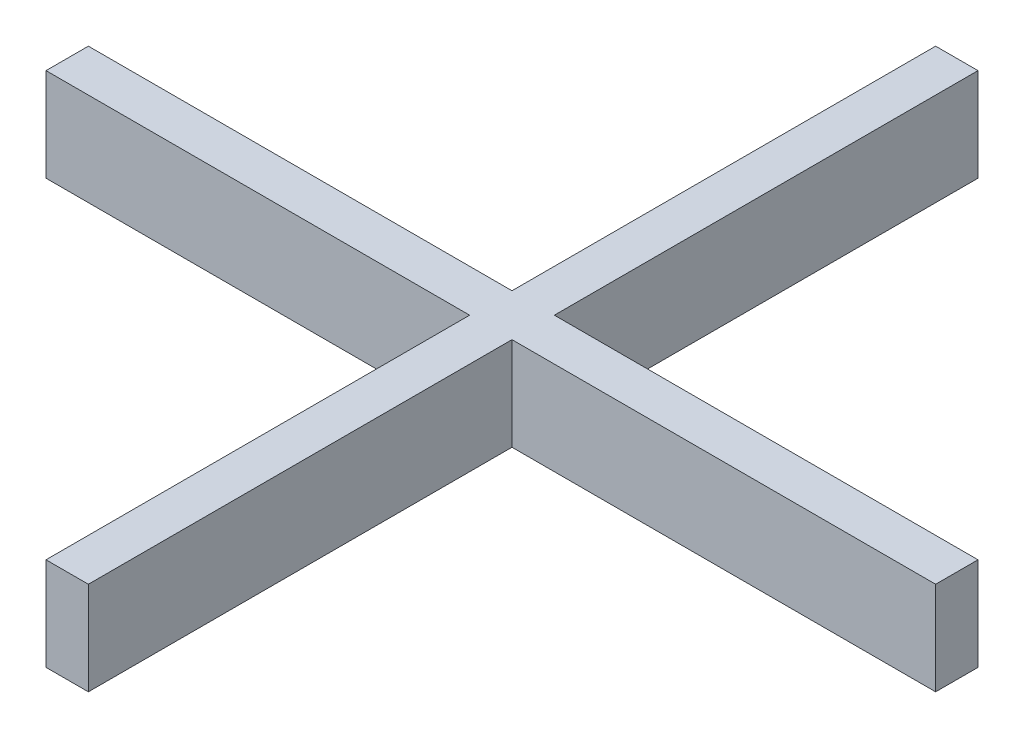
ISO-10303-21;
HEADER;
FILE_DESCRIPTION(('STEP AP214'),'2;1');
FILE_NAME('part.step','',(''),(''),'','','');
FILE_SCHEMA(('AUTOMOTIVE_DESIGN { 1 0 10303 214 1 1 1 1 }'));
ENDSEC;
DATA;
#1=APPLICATION_CONTEXT('core data for automotive mechanical design processes');
#2=APPLICATION_PROTOCOL_DEFINITION('international standard','automotive_design',2000,#1);
#3=PRODUCT_CONTEXT('',#1,'mechanical');
#4=PRODUCT('Part','Part','',(#3));
#5=PRODUCT_RELATED_PRODUCT_CATEGORY('part','',(#4));
#6=PRODUCT_DEFINITION_FORMATION('','',#4);
#7=PRODUCT_DEFINITION_CONTEXT('part definition',#1,'design');
#8=PRODUCT_DEFINITION('design','',#6,#7);
#9=PRODUCT_DEFINITION_SHAPE('','',#8);
#10=(LENGTH_UNIT() NAMED_UNIT(*) SI_UNIT(.MILLI.,.METRE.));
#11=(NAMED_UNIT(*) PLANE_ANGLE_UNIT() SI_UNIT($,.RADIAN.));
#12=(NAMED_UNIT(*) SI_UNIT($,.STERADIAN.) SOLID_ANGLE_UNIT());
#13=UNCERTAINTY_MEASURE_WITH_UNIT(LENGTH_MEASURE(1.E-05),#10,'distance_accuracy_value','');
#14=(GEOMETRIC_REPRESENTATION_CONTEXT(3) GLOBAL_UNCERTAINTY_ASSIGNED_CONTEXT((#13)) GLOBAL_UNIT_ASSIGNED_CONTEXT((#10,
#11,#12)) REPRESENTATION_CONTEXT('',''));
#15=CARTESIAN_POINT('',(0.,0.,0.));
#16=DIRECTION('',(0.,0.,1.));
#17=DIRECTION('',(1.,0.,0.));
#18=AXIS2_PLACEMENT_3D('',#15,#16,#17);
#19=CARTESIAN_POINT('',(-10.5,1.1,0.5));
#20=DIRECTION('',(1.,0.,0.));
#21=DIRECTION('',(0.,0.,-1.));
#22=AXIS2_PLACEMENT_3D('',#19,#20,#21);
#23=PLANE('',#22);
#24=DIRECTION('',(0.,0.,1.));
#25=VECTOR('',#24,1.);
#26=CARTESIAN_POINT('',(-10.5,-1.1,0.5));
#27=LINE('',#26,#25);
#28=CARTESIAN_POINT('',(-10.5,-1.1,-0.5));
#29=VERTEX_POINT('',#28);
#30=CARTESIAN_POINT('',(-10.5,-1.1,0.5));
#31=VERTEX_POINT('',#30);
#32=EDGE_CURVE('E164',#29,#31,#27,.T.);
#33=ORIENTED_EDGE('',*,*,#32,.T.);
#34=DIRECTION('',(0.,-1.,0.));
#35=VECTOR('',#34,1.);
#36=CARTESIAN_POINT('',(-10.5,1.1,0.5));
#37=LINE('',#36,#35);
#38=CARTESIAN_POINT('',(-10.5,1.1,0.5));
#39=VERTEX_POINT('',#38);
#40=EDGE_CURVE('E11',#39,#31,#37,.T.);
#41=ORIENTED_EDGE('',*,*,#40,.F.);
#42=DIRECTION('',(0.,0.,1.));
#43=VECTOR('',#42,1.);
#44=CARTESIAN_POINT('',(-10.5,1.1,0.5));
#45=LINE('',#44,#43);
#46=CARTESIAN_POINT('',(-10.5,1.1,-0.5));
#47=VERTEX_POINT('',#46);
#48=EDGE_CURVE('E198',#47,#39,#45,.T.);
#49=ORIENTED_EDGE('',*,*,#48,.F.);
#50=DIRECTION('',(0.,-1.,0.));
#51=VECTOR('',#50,1.);
#52=CARTESIAN_POINT('',(-10.5,1.1,-0.5));
#53=LINE('',#52,#51);
#54=EDGE_CURVE('E160',#47,#29,#53,.T.);
#55=ORIENTED_EDGE('',*,*,#54,.T.);
#56=EDGE_LOOP('',(#33,#41,#49,#55));
#57=FACE_BOUND('',#56,.T.);
#58=ADVANCED_FACE('F39',(#57),#23,.F.);
#59=CARTESIAN_POINT('',(-0.5,1.1,0.5));
#60=DIRECTION('',(0.,0.,-1.));
#61=DIRECTION('',(-1.,0.,0.));
#62=AXIS2_PLACEMENT_3D('',#59,#60,#61);
#63=PLANE('',#62);
#64=DIRECTION('',(1.,0.,0.));
#65=VECTOR('',#64,1.);
#66=CARTESIAN_POINT('',(-0.5,-1.1,0.5));
#67=LINE('',#66,#65);
#68=CARTESIAN_POINT('',(-0.5,-1.1,0.5));
#69=VERTEX_POINT('',#68);
#70=EDGE_CURVE('E168',#31,#69,#67,.T.);
#71=ORIENTED_EDGE('',*,*,#70,.T.);
#72=DIRECTION('',(0.,-1.,0.));
#73=VECTOR('',#72,1.);
#74=CARTESIAN_POINT('',(-0.5,1.1,0.5));
#75=LINE('',#74,#73);
#76=CARTESIAN_POINT('',(-0.5,1.1,0.5));
#77=VERTEX_POINT('',#76);
#78=EDGE_CURVE('E48',#77,#69,#75,.T.);
#79=ORIENTED_EDGE('',*,*,#78,.F.);
#80=DIRECTION('',(1.,0.,0.));
#81=VECTOR('',#80,1.);
#82=CARTESIAN_POINT('',(-0.5,1.1,0.5));
#83=LINE('',#82,#81);
#84=EDGE_CURVE('E111',#39,#77,#83,.T.);
#85=ORIENTED_EDGE('',*,*,#84,.F.);
#86=ORIENTED_EDGE('',*,*,#40,.T.);
#87=EDGE_LOOP('',(#71,#79,#85,#86));
#88=FACE_BOUND('',#87,.T.);
#89=ADVANCED_FACE('F292',(#88),#63,.F.);
#90=CARTESIAN_POINT('',(-0.5,1.1,10.5));
#91=DIRECTION('',(1.,0.,0.));
#92=DIRECTION('',(0.,0.,-1.));
#93=AXIS2_PLACEMENT_3D('',#90,#91,#92);
#94=PLANE('',#93);
#95=DIRECTION('',(0.,0.,1.));
#96=VECTOR('',#95,1.);
#97=CARTESIAN_POINT('',(-0.5,-1.1,10.5));
#98=LINE('',#97,#96);
#99=CARTESIAN_POINT('',(-0.5,-1.1,10.5));
#100=VERTEX_POINT('',#99);
#101=EDGE_CURVE('E171',#69,#100,#98,.T.);
#102=ORIENTED_EDGE('',*,*,#101,.T.);
#103=DIRECTION('',(0.,-1.,0.));
#104=VECTOR('',#103,1.);
#105=CARTESIAN_POINT('',(-0.5,1.1,10.5));
#106=LINE('',#105,#104);
#107=CARTESIAN_POINT('',(-0.5,1.1,10.5));
#108=VERTEX_POINT('',#107);
#109=EDGE_CURVE('E225',#108,#100,#106,.T.);
#110=ORIENTED_EDGE('',*,*,#109,.F.);
#111=DIRECTION('',(0.,0.,1.));
#112=VECTOR('',#111,1.);
#113=CARTESIAN_POINT('',(-0.5,1.1,10.5));
#114=LINE('',#113,#112);
#115=EDGE_CURVE('E235',#77,#108,#114,.T.);
#116=ORIENTED_EDGE('',*,*,#115,.F.);
#117=ORIENTED_EDGE('',*,*,#78,.T.);
#118=EDGE_LOOP('',(#102,#110,#116,#117));
#119=FACE_BOUND('',#118,.T.);
#120=ADVANCED_FACE('F233',(#119),#94,.F.);
#121=CARTESIAN_POINT('',(0.5,1.1,10.5));
#122=DIRECTION('',(0.,0.,-1.));
#123=DIRECTION('',(-1.,0.,0.));
#124=AXIS2_PLACEMENT_3D('',#121,#122,#123);
#125=PLANE('',#124);
#126=DIRECTION('',(1.,0.,0.));
#127=VECTOR('',#126,1.);
#128=CARTESIAN_POINT('',(0.5,-1.1,10.5));
#129=LINE('',#128,#127);
#130=CARTESIAN_POINT('',(0.5,-1.1,10.5));
#131=VERTEX_POINT('',#130);
#132=EDGE_CURVE('E174',#100,#131,#129,.T.);
#133=ORIENTED_EDGE('',*,*,#132,.T.);
#134=DIRECTION('',(0.,-1.,0.));
#135=VECTOR('',#134,1.);
#136=CARTESIAN_POINT('',(0.5,1.1,10.5));
#137=LINE('',#136,#135);
#138=CARTESIAN_POINT('',(0.5,1.1,10.5));
#139=VERTEX_POINT('',#138);
#140=EDGE_CURVE('E221',#139,#131,#137,.T.);
#141=ORIENTED_EDGE('',*,*,#140,.F.);
#142=DIRECTION('',(1.,0.,0.));
#143=VECTOR('',#142,1.);
#144=CARTESIAN_POINT('',(0.5,1.1,10.5));
#145=LINE('',#144,#143);
#146=EDGE_CURVE('E254',#108,#139,#145,.T.);
#147=ORIENTED_EDGE('',*,*,#146,.F.);
#148=ORIENTED_EDGE('',*,*,#109,.T.);
#149=EDGE_LOOP('',(#133,#141,#147,#148));
#150=FACE_BOUND('',#149,.T.);
#151=ADVANCED_FACE('F244',(#150),#125,.F.);
#152=CARTESIAN_POINT('',(0.5,1.1,0.5));
#153=DIRECTION('',(-1.,0.,0.));
#154=DIRECTION('',(0.,0.,1.));
#155=AXIS2_PLACEMENT_3D('',#152,#153,#154);
#156=PLANE('',#155);
#157=DIRECTION('',(0.,0.,-1.));
#158=VECTOR('',#157,1.);
#159=CARTESIAN_POINT('',(0.5,-1.1,0.5));
#160=LINE('',#159,#158);
#161=CARTESIAN_POINT('',(0.5,-1.1,0.5));
#162=VERTEX_POINT('',#161);
#163=EDGE_CURVE('E177',#131,#162,#160,.T.);
#164=ORIENTED_EDGE('',*,*,#163,.T.);
#165=DIRECTION('',(0.,-1.,0.));
#166=VECTOR('',#165,1.);
#167=CARTESIAN_POINT('',(0.5,1.1,0.5));
#168=LINE('',#167,#166);
#169=CARTESIAN_POINT('',(0.5,1.1,0.5));
#170=VERTEX_POINT('',#169);
#171=EDGE_CURVE('E217',#170,#162,#168,.T.);
#172=ORIENTED_EDGE('',*,*,#171,.F.);
#173=DIRECTION('',(0.,0.,-1.));
#174=VECTOR('',#173,1.);
#175=CARTESIAN_POINT('',(0.5,1.1,0.5));
#176=LINE('',#175,#174);
#177=EDGE_CURVE('E250',#139,#170,#176,.T.);
#178=ORIENTED_EDGE('',*,*,#177,.F.);
#179=ORIENTED_EDGE('',*,*,#140,.T.);
#180=EDGE_LOOP('',(#164,#172,#178,#179));
#181=FACE_BOUND('',#180,.T.);
#182=ADVANCED_FACE('F248',(#181),#156,.F.);
#183=CARTESIAN_POINT('',(10.5,1.1,0.5));
#184=DIRECTION('',(0.,0.,-1.));
#185=DIRECTION('',(-1.,0.,0.));
#186=AXIS2_PLACEMENT_3D('',#183,#184,#185);
#187=PLANE('',#186);
#188=DIRECTION('',(1.,0.,0.));
#189=VECTOR('',#188,1.);
#190=CARTESIAN_POINT('',(10.5,-1.1,0.5));
#191=LINE('',#190,#189);
#192=CARTESIAN_POINT('',(10.5,-1.1,0.5));
#193=VERTEX_POINT('',#192);
#194=EDGE_CURVE('E180',#162,#193,#191,.T.);
#195=ORIENTED_EDGE('',*,*,#194,.T.);
#196=DIRECTION('',(0.,-1.,0.));
#197=VECTOR('',#196,1.);
#198=CARTESIAN_POINT('',(10.5,1.1,0.5));
#199=LINE('',#198,#197);
#200=CARTESIAN_POINT('',(10.5,1.1,0.5));
#201=VERTEX_POINT('',#200);
#202=EDGE_CURVE('E213',#201,#193,#199,.T.);
#203=ORIENTED_EDGE('',*,*,#202,.F.);
#204=DIRECTION('',(1.,0.,0.));
#205=VECTOR('',#204,1.);
#206=CARTESIAN_POINT('',(10.5,1.1,0.5));
#207=LINE('',#206,#205);
#208=EDGE_CURVE('E253',#170,#201,#207,.T.);
#209=ORIENTED_EDGE('',*,*,#208,.F.);
#210=ORIENTED_EDGE('',*,*,#171,.T.);
#211=EDGE_LOOP('',(#195,#203,#209,#210));
#212=FACE_BOUND('',#211,.T.);
#213=ADVANCED_FACE('F305',(#212),#187,.F.);
#214=CARTESIAN_POINT('',(10.5,1.1,-0.5));
#215=DIRECTION('',(-1.,0.,0.));
#216=DIRECTION('',(0.,0.,1.));
#217=AXIS2_PLACEMENT_3D('',#214,#215,#216);
#218=PLANE('',#217);
#219=DIRECTION('',(0.,0.,-1.));
#220=VECTOR('',#219,1.);
#221=CARTESIAN_POINT('',(10.5,-1.1,-0.5));
#222=LINE('',#221,#220);
#223=CARTESIAN_POINT('',(10.5,-1.1,-0.5));
#224=VERTEX_POINT('',#223);
#225=EDGE_CURVE('E183',#193,#224,#222,.T.);
#226=ORIENTED_EDGE('',*,*,#225,.T.);
#227=DIRECTION('',(0.,-1.,0.));
#228=VECTOR('',#227,1.);
#229=CARTESIAN_POINT('',(10.5,1.1,-0.5));
#230=LINE('',#229,#228);
#231=CARTESIAN_POINT('',(10.5,1.1,-0.5));
#232=VERTEX_POINT('',#231);
#233=EDGE_CURVE('E209',#232,#224,#230,.T.);
#234=ORIENTED_EDGE('',*,*,#233,.F.);
#235=DIRECTION('',(0.,0.,-1.));
#236=VECTOR('',#235,1.);
#237=CARTESIAN_POINT('',(10.5,1.1,-0.5));
#238=LINE('',#237,#236);
#239=EDGE_CURVE('E258',#201,#232,#238,.T.);
#240=ORIENTED_EDGE('',*,*,#239,.F.);
#241=ORIENTED_EDGE('',*,*,#202,.T.);
#242=EDGE_LOOP('',(#226,#234,#240,#241));
#243=FACE_BOUND('',#242,.T.);
#244=ADVANCED_FACE('F308',(#243),#218,.F.);
#245=CARTESIAN_POINT('',(0.5,1.1,-0.5));
#246=DIRECTION('',(0.,0.,1.));
#247=DIRECTION('',(1.,0.,0.));
#248=AXIS2_PLACEMENT_3D('',#245,#246,#247);
#249=PLANE('',#248);
#250=DIRECTION('',(-1.,0.,0.));
#251=VECTOR('',#250,1.);
#252=CARTESIAN_POINT('',(0.5,-1.1,-0.5));
#253=LINE('',#252,#251);
#254=CARTESIAN_POINT('',(0.5,-1.1,-0.5));
#255=VERTEX_POINT('',#254);
#256=EDGE_CURVE('E186',#224,#255,#253,.T.);
#257=ORIENTED_EDGE('',*,*,#256,.T.);
#258=DIRECTION('',(0.,-1.,0.));
#259=VECTOR('',#258,1.);
#260=CARTESIAN_POINT('',(0.5,1.1,-0.5));
#261=LINE('',#260,#259);
#262=CARTESIAN_POINT('',(0.5,1.1,-0.5));
#263=VERTEX_POINT('',#262);
#264=EDGE_CURVE('E205',#263,#255,#261,.T.);
#265=ORIENTED_EDGE('',*,*,#264,.F.);
#266=DIRECTION('',(-1.,0.,0.));
#267=VECTOR('',#266,1.);
#268=CARTESIAN_POINT('',(0.5,1.1,-0.5));
#269=LINE('',#268,#267);
#270=EDGE_CURVE('E265',#232,#263,#269,.T.);
#271=ORIENTED_EDGE('',*,*,#270,.F.);
#272=ORIENTED_EDGE('',*,*,#233,.T.);
#273=EDGE_LOOP('',(#257,#265,#271,#272));
#274=FACE_BOUND('',#273,.T.);
#275=ADVANCED_FACE('F273',(#274),#249,.F.);
#276=CARTESIAN_POINT('',(0.5,1.1,-10.5));
#277=DIRECTION('',(-1.,0.,0.));
#278=DIRECTION('',(0.,0.,1.));
#279=AXIS2_PLACEMENT_3D('',#276,#277,#278);
#280=PLANE('',#279);
#281=DIRECTION('',(0.,0.,-1.));
#282=VECTOR('',#281,1.);
#283=CARTESIAN_POINT('',(0.5,-1.1,-10.5));
#284=LINE('',#283,#282);
#285=CARTESIAN_POINT('',(0.5,-1.1,-10.5));
#286=VERTEX_POINT('',#285);
#287=EDGE_CURVE('E189',#255,#286,#284,.T.);
#288=ORIENTED_EDGE('',*,*,#287,.T.);
#289=DIRECTION('',(0.,-1.,0.));
#290=VECTOR('',#289,1.);
#291=CARTESIAN_POINT('',(0.5,1.1,-10.5));
#292=LINE('',#291,#290);
#293=CARTESIAN_POINT('',(0.5,1.1,-10.5));
#294=VERTEX_POINT('',#293);
#295=EDGE_CURVE('E153',#294,#286,#292,.T.);
#296=ORIENTED_EDGE('',*,*,#295,.F.);
#297=DIRECTION('',(0.,0.,-1.));
#298=VECTOR('',#297,1.);
#299=CARTESIAN_POINT('',(0.5,1.1,-10.5));
#300=LINE('',#299,#298);
#301=EDGE_CURVE('E142',#263,#294,#300,.T.);
#302=ORIENTED_EDGE('',*,*,#301,.F.);
#303=ORIENTED_EDGE('',*,*,#264,.T.);
#304=EDGE_LOOP('',(#288,#296,#302,#303));
#305=FACE_BOUND('',#304,.T.);
#306=ADVANCED_FACE('F277',(#305),#280,.F.);
#307=CARTESIAN_POINT('',(-0.5,1.1,-10.5));
#308=DIRECTION('',(0.,0.,1.));
#309=DIRECTION('',(1.,0.,0.));
#310=AXIS2_PLACEMENT_3D('',#307,#308,#309);
#311=PLANE('',#310);
#312=DIRECTION('',(-1.,0.,0.));
#313=VECTOR('',#312,1.);
#314=CARTESIAN_POINT('',(-0.5,-1.1,-10.5));
#315=LINE('',#314,#313);
#316=CARTESIAN_POINT('',(-0.5,-1.1,-10.5));
#317=VERTEX_POINT('',#316);
#318=EDGE_CURVE('E151',#286,#317,#315,.T.);
#319=ORIENTED_EDGE('',*,*,#318,.T.);
#320=DIRECTION('',(0.,-1.,0.));
#321=VECTOR('',#320,1.);
#322=CARTESIAN_POINT('',(-0.5,1.1,-10.5));
#323=LINE('',#322,#321);
#324=CARTESIAN_POINT('',(-0.5,1.1,-10.5));
#325=VERTEX_POINT('',#324);
#326=EDGE_CURVE('E148',#325,#317,#323,.T.);
#327=ORIENTED_EDGE('',*,*,#326,.F.);
#328=DIRECTION('',(-1.,0.,0.));
#329=VECTOR('',#328,1.);
#330=CARTESIAN_POINT('',(-0.5,1.1,-10.5));
#331=LINE('',#330,#329);
#332=EDGE_CURVE('E136',#294,#325,#331,.T.);
#333=ORIENTED_EDGE('',*,*,#332,.F.);
#334=ORIENTED_EDGE('',*,*,#295,.T.);
#335=EDGE_LOOP('',(#319,#327,#333,#334));
#336=FACE_BOUND('',#335,.T.);
#337=ADVANCED_FACE('F149',(#336),#311,.F.);
#338=CARTESIAN_POINT('',(-0.5,1.1,-0.5));
#339=DIRECTION('',(1.,0.,0.));
#340=DIRECTION('',(0.,0.,-1.));
#341=AXIS2_PLACEMENT_3D('',#338,#339,#340);
#342=PLANE('',#341);
#343=DIRECTION('',(0.,0.,1.));
#344=VECTOR('',#343,1.);
#345=CARTESIAN_POINT('',(-0.5,-1.1,-0.5));
#346=LINE('',#345,#344);
#347=CARTESIAN_POINT('',(-0.5,-1.1,-0.5));
#348=VERTEX_POINT('',#347);
#349=EDGE_CURVE('E97',#317,#348,#346,.T.);
#350=ORIENTED_EDGE('',*,*,#349,.T.);
#351=DIRECTION('',(0.,-1.,0.));
#352=VECTOR('',#351,1.);
#353=CARTESIAN_POINT('',(-0.5,1.1,-0.5));
#354=LINE('',#353,#352);
#355=CARTESIAN_POINT('',(-0.5,1.1,-0.5));
#356=VERTEX_POINT('',#355);
#357=EDGE_CURVE('E154',#356,#348,#354,.T.);
#358=ORIENTED_EDGE('',*,*,#357,.F.);
#359=DIRECTION('',(0.,0.,1.));
#360=VECTOR('',#359,1.);
#361=CARTESIAN_POINT('',(-0.5,1.1,-0.5));
#362=LINE('',#361,#360);
#363=EDGE_CURVE('E140',#325,#356,#362,.T.);
#364=ORIENTED_EDGE('',*,*,#363,.F.);
#365=ORIENTED_EDGE('',*,*,#326,.T.);
#366=EDGE_LOOP('',(#350,#358,#364,#365));
#367=FACE_BOUND('',#366,.T.);
#368=ADVANCED_FACE('F156',(#367),#342,.F.);
#369=CARTESIAN_POINT('',(-10.5,1.1,-0.5));
#370=DIRECTION('',(0.,0.,1.));
#371=DIRECTION('',(1.,0.,0.));
#372=AXIS2_PLACEMENT_3D('',#369,#370,#371);
#373=PLANE('',#372);
#374=DIRECTION('',(-1.,0.,0.));
#375=VECTOR('',#374,1.);
#376=CARTESIAN_POINT('',(-10.5,-1.1,-0.5));
#377=LINE('',#376,#375);
#378=EDGE_CURVE('E103',#348,#29,#377,.T.);
#379=ORIENTED_EDGE('',*,*,#378,.T.);
#380=ORIENTED_EDGE('',*,*,#54,.F.);
#381=DIRECTION('',(-1.,0.,0.));
#382=VECTOR('',#381,1.);
#383=CARTESIAN_POINT('',(-10.5,1.1,-0.5));
#384=LINE('',#383,#382);
#385=EDGE_CURVE('E56',#356,#47,#384,.T.);
#386=ORIENTED_EDGE('',*,*,#385,.F.);
#387=ORIENTED_EDGE('',*,*,#357,.T.);
#388=EDGE_LOOP('',(#379,#380,#386,#387));
#389=FACE_BOUND('',#388,.T.);
#390=ADVANCED_FACE('F281',(#389),#373,.F.);
#391=CARTESIAN_POINT('',(0.,1.1,0.));
#392=DIRECTION('',(0.,-1.,0.));
#393=DIRECTION('',(0.,0.,-1.));
#394=AXIS2_PLACEMENT_3D('',#391,#392,#393);
#395=PLANE('',#394);
#396=ORIENTED_EDGE('',*,*,#48,.T.);
#397=ORIENTED_EDGE('',*,*,#84,.T.);
#398=ORIENTED_EDGE('',*,*,#115,.T.);
#399=ORIENTED_EDGE('',*,*,#146,.T.);
#400=ORIENTED_EDGE('',*,*,#177,.T.);
#401=ORIENTED_EDGE('',*,*,#208,.T.);
#402=ORIENTED_EDGE('',*,*,#239,.T.);
#403=ORIENTED_EDGE('',*,*,#270,.T.);
#404=ORIENTED_EDGE('',*,*,#301,.T.);
#405=ORIENTED_EDGE('',*,*,#332,.T.);
#406=ORIENTED_EDGE('',*,*,#363,.T.);
#407=ORIENTED_EDGE('',*,*,#385,.T.);
#408=EDGE_LOOP('',(#396,#397,#398,#399,#400,#401,#402,#403,#404,#405,#406,#407));
#409=FACE_BOUND('',#408,.T.);
#410=ADVANCED_FACE('F138',(#409),#395,.F.);
#411=CARTESIAN_POINT('',(0.,-1.1,0.));
#412=DIRECTION('',(0.,-1.,0.));
#413=DIRECTION('',(0.,0.,-1.));
#414=AXIS2_PLACEMENT_3D('',#411,#412,#413);
#415=PLANE('',#414);
#416=ORIENTED_EDGE('',*,*,#32,.F.);
#417=ORIENTED_EDGE('',*,*,#378,.F.);
#418=ORIENTED_EDGE('',*,*,#349,.F.);
#419=ORIENTED_EDGE('',*,*,#318,.F.);
#420=ORIENTED_EDGE('',*,*,#287,.F.);
#421=ORIENTED_EDGE('',*,*,#256,.F.);
#422=ORIENTED_EDGE('',*,*,#225,.F.);
#423=ORIENTED_EDGE('',*,*,#194,.F.);
#424=ORIENTED_EDGE('',*,*,#163,.F.);
#425=ORIENTED_EDGE('',*,*,#132,.F.);
#426=ORIENTED_EDGE('',*,*,#101,.F.);
#427=ORIENTED_EDGE('',*,*,#70,.F.);
#428=EDGE_LOOP('',(#416,#417,#418,#419,#420,#421,#422,#423,#424,#425,#426,#427));
#429=FACE_BOUND('',#428,.T.);
#430=ADVANCED_FACE('F239',(#429),#415,.T.);
#431=CLOSED_SHELL('',(#58,#89,#120,#151,#182,#213,#244,#275,#306,#337,#368,#390,#410,#430));
#432=MANIFOLD_SOLID_BREP('B2',#431);
#433=ADVANCED_BREP_SHAPE_REPRESENTATION('',(#18,#432),#14);
#434=SHAPE_DEFINITION_REPRESENTATION(#9,#433);
ENDSEC;
END-ISO-10303-21;
